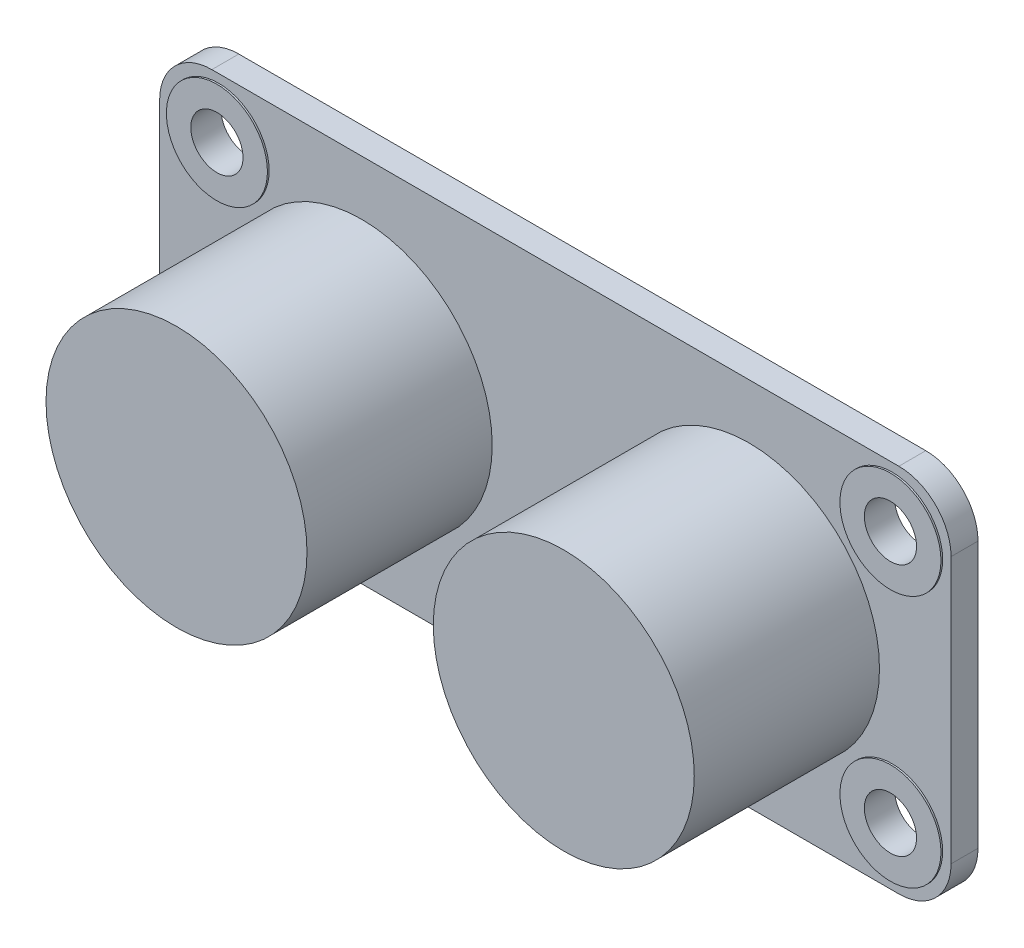
ISO-10303-21;
HEADER;
FILE_DESCRIPTION(('STEP AP214'),'2;1');
FILE_NAME('part.step','',(''),(''),'','','');
FILE_SCHEMA(('AUTOMOTIVE_DESIGN { 1 0 10303 214 1 1 1 1 }'));
ENDSEC;
DATA;
#1=APPLICATION_CONTEXT('core data for automotive mechanical design processes');
#2=APPLICATION_PROTOCOL_DEFINITION('international standard','automotive_design',2000,#1);
#3=PRODUCT_CONTEXT('',#1,'mechanical');
#4=PRODUCT('Part','Part','',(#3));
#5=PRODUCT_RELATED_PRODUCT_CATEGORY('part','',(#4));
#6=PRODUCT_DEFINITION_FORMATION('','',#4);
#7=PRODUCT_DEFINITION_CONTEXT('part definition',#1,'design');
#8=PRODUCT_DEFINITION('design','',#6,#7);
#9=PRODUCT_DEFINITION_SHAPE('','',#8);
#10=(LENGTH_UNIT() NAMED_UNIT(*) SI_UNIT(.MILLI.,.METRE.));
#11=(NAMED_UNIT(*) PLANE_ANGLE_UNIT() SI_UNIT($,.RADIAN.));
#12=(NAMED_UNIT(*) SI_UNIT($,.STERADIAN.) SOLID_ANGLE_UNIT());
#13=UNCERTAINTY_MEASURE_WITH_UNIT(LENGTH_MEASURE(1.E-05),#10,'distance_accuracy_value','');
#14=(GEOMETRIC_REPRESENTATION_CONTEXT(3) GLOBAL_UNCERTAINTY_ASSIGNED_CONTEXT((#13)) GLOBAL_UNIT_ASSIGNED_CONTEXT((#10,
#11,#12)) REPRESENTATION_CONTEXT('',''));
#15=CARTESIAN_POINT('',(0.,0.,0.));
#16=DIRECTION('',(0.,0.,1.));
#17=DIRECTION('',(1.,0.,0.));
#18=AXIS2_PLACEMENT_3D('',#15,#16,#17);
#19=CARTESIAN_POINT('',(0.,0.,1.6));
#20=DIRECTION('',(0.,0.,-1.));
#21=DIRECTION('',(-1.,0.,0.));
#22=AXIS2_PLACEMENT_3D('',#19,#20,#21);
#23=PLANE('',#22);
#24=CARTESIAN_POINT('',(-11.5,0.,1.6));
#25=DIRECTION('',(0.,0.,-1.));
#26=DIRECTION('',(-1.,0.,0.));
#27=AXIS2_PLACEMENT_3D('',#24,#25,#26);
#28=CIRCLE('',#27,7.75);
#29=CARTESIAN_POINT('',(-19.25,0.,1.6));
#30=VERTEX_POINT('',#29);
#31=EDGE_CURVE('E11',#30,#30,#28,.F.);
#32=ORIENTED_EDGE('',*,*,#31,.F.);
#33=EDGE_LOOP('',(#32));
#34=FACE_BOUND('',#33,.T.);
#35=CARTESIAN_POINT('',(11.5,0.,1.6));
#36=DIRECTION('',(0.,0.,-1.));
#37=DIRECTION('',(-1.,0.,0.));
#38=AXIS2_PLACEMENT_3D('',#35,#36,#37);
#39=CIRCLE('',#38,7.75);
#40=CARTESIAN_POINT('',(3.75,0.,1.6));
#41=VERTEX_POINT('',#40);
#42=EDGE_CURVE('E55',#41,#41,#39,.F.);
#43=ORIENTED_EDGE('',*,*,#42,.F.);
#44=EDGE_LOOP('',(#43));
#45=FACE_BOUND('',#44,.T.);
#46=CARTESIAN_POINT('',(20.,-7.5,1.6));
#47=DIRECTION('',(0.,0.,-1.));
#48=DIRECTION('',(-1.,0.,0.));
#49=AXIS2_PLACEMENT_3D('',#46,#47,#48);
#50=CIRCLE('',#49,3.);
#51=CARTESIAN_POINT('',(17.,-7.5,1.6));
#52=VERTEX_POINT('',#51);
#53=EDGE_CURVE('E220',#52,#52,#50,.T.);
#54=ORIENTED_EDGE('',*,*,#53,.T.);
#55=EDGE_LOOP('',(#54));
#56=FACE_BOUND('',#55,.T.);
#57=CARTESIAN_POINT('',(20.,7.5,1.6));
#58=DIRECTION('',(0.,0.,-1.));
#59=DIRECTION('',(-1.,0.,0.));
#60=AXIS2_PLACEMENT_3D('',#57,#58,#59);
#61=CIRCLE('',#60,3.);
#62=CARTESIAN_POINT('',(17.,7.5,1.6));
#63=VERTEX_POINT('',#62);
#64=EDGE_CURVE('E224',#63,#63,#61,.T.);
#65=ORIENTED_EDGE('',*,*,#64,.T.);
#66=EDGE_LOOP('',(#65));
#67=FACE_BOUND('',#66,.T.);
#68=CARTESIAN_POINT('',(-20.,-7.5,1.6));
#69=DIRECTION('',(0.,0.,-1.));
#70=DIRECTION('',(-1.,0.,0.));
#71=AXIS2_PLACEMENT_3D('',#68,#69,#70);
#72=CIRCLE('',#71,3.);
#73=CARTESIAN_POINT('',(-23.,-7.5,1.6));
#74=VERTEX_POINT('',#73);
#75=EDGE_CURVE('E228',#74,#74,#72,.T.);
#76=ORIENTED_EDGE('',*,*,#75,.T.);
#77=EDGE_LOOP('',(#76));
#78=FACE_BOUND('',#77,.T.);
#79=CARTESIAN_POINT('',(-20.,7.5,1.6));
#80=DIRECTION('',(0.,0.,-1.));
#81=DIRECTION('',(-1.,0.,0.));
#82=AXIS2_PLACEMENT_3D('',#79,#80,#81);
#83=CIRCLE('',#82,3.);
#84=CARTESIAN_POINT('',(-23.,7.5,1.6));
#85=VERTEX_POINT('',#84);
#86=EDGE_CURVE('E231',#85,#85,#83,.T.);
#87=ORIENTED_EDGE('',*,*,#86,.T.);
#88=EDGE_LOOP('',(#87));
#89=FACE_BOUND('',#88,.T.);
#90=DIRECTION('',(-1.,0.,0.));
#91=VECTOR('',#90,1.);
#92=CARTESIAN_POINT('',(-23.5,11.,1.6));
#93=LINE('',#92,#91);
#94=CARTESIAN_POINT('',(20.4,11.,1.6));
#95=VERTEX_POINT('',#94);
#96=CARTESIAN_POINT('',(-20.4,11.,1.6));
#97=VERTEX_POINT('',#96);
#98=EDGE_CURVE('E234',#95,#97,#93,.T.);
#99=ORIENTED_EDGE('',*,*,#98,.T.);
#100=CARTESIAN_POINT('',(-20.4,7.9,1.6));
#101=DIRECTION('',(0.,0.,-1.));
#102=DIRECTION('',(-1.,0.,0.));
#103=AXIS2_PLACEMENT_3D('',#100,#101,#102);
#104=CIRCLE('',#103,3.1);
#105=CARTESIAN_POINT('',(-23.5,7.9,1.6));
#106=VERTEX_POINT('',#105);
#107=EDGE_CURVE('E176',#97,#106,#104,.F.);
#108=ORIENTED_EDGE('',*,*,#107,.T.);
#109=DIRECTION('',(0.,-1.,0.));
#110=VECTOR('',#109,1.);
#111=CARTESIAN_POINT('',(-23.5,-11.,1.6));
#112=LINE('',#111,#110);
#113=CARTESIAN_POINT('',(-23.5,-7.9,1.6));
#114=VERTEX_POINT('',#113);
#115=EDGE_CURVE('E134',#106,#114,#112,.T.);
#116=ORIENTED_EDGE('',*,*,#115,.T.);
#117=CARTESIAN_POINT('',(-20.4,-7.9,1.6));
#118=DIRECTION('',(0.,0.,-1.));
#119=DIRECTION('',(-1.,0.,0.));
#120=AXIS2_PLACEMENT_3D('',#117,#118,#119);
#121=CIRCLE('',#120,3.1);
#122=CARTESIAN_POINT('',(-20.4,-11.,1.6));
#123=VERTEX_POINT('',#122);
#124=EDGE_CURVE('E69',#114,#123,#121,.F.);
#125=ORIENTED_EDGE('',*,*,#124,.T.);
#126=DIRECTION('',(1.,0.,0.));
#127=VECTOR('',#126,1.);
#128=CARTESIAN_POINT('',(-23.5,-11.,1.6));
#129=LINE('',#128,#127);
#130=CARTESIAN_POINT('',(20.4,-11.,1.6));
#131=VERTEX_POINT('',#130);
#132=EDGE_CURVE('E154',#123,#131,#129,.T.);
#133=ORIENTED_EDGE('',*,*,#132,.T.);
#134=CARTESIAN_POINT('',(20.4,-7.9,1.6));
#135=DIRECTION('',(0.,0.,-1.));
#136=DIRECTION('',(-1.,0.,0.));
#137=AXIS2_PLACEMENT_3D('',#134,#135,#136);
#138=CIRCLE('',#137,3.1);
#139=CARTESIAN_POINT('',(23.5,-7.9,1.6));
#140=VERTEX_POINT('',#139);
#141=EDGE_CURVE('E171',#131,#140,#138,.F.);
#142=ORIENTED_EDGE('',*,*,#141,.T.);
#143=DIRECTION('',(0.,1.,0.));
#144=VECTOR('',#143,1.);
#145=CARTESIAN_POINT('',(23.5,-11.,1.6));
#146=LINE('',#145,#144);
#147=CARTESIAN_POINT('',(23.5,7.9,1.6));
#148=VERTEX_POINT('',#147);
#149=EDGE_CURVE('E147',#140,#148,#146,.T.);
#150=ORIENTED_EDGE('',*,*,#149,.T.);
#151=CARTESIAN_POINT('',(20.4,7.9,1.6));
#152=DIRECTION('',(0.,0.,-1.));
#153=DIRECTION('',(-1.,0.,0.));
#154=AXIS2_PLACEMENT_3D('',#151,#152,#153);
#155=CIRCLE('',#154,3.1);
#156=EDGE_CURVE('E168',#148,#95,#155,.F.);
#157=ORIENTED_EDGE('',*,*,#156,.T.);
#158=EDGE_LOOP('',(#99,#108,#116,#125,#133,#142,#150,#157));
#159=FACE_BOUND('',#158,.T.);
#160=ADVANCED_FACE('F46',(#34,#45,#56,#67,#78,#89,#159),#23,.F.);
#161=CARTESIAN_POINT('',(0.,0.,0.));
#162=DIRECTION('',(0.,0.,-1.));
#163=DIRECTION('',(-1.,0.,0.));
#164=AXIS2_PLACEMENT_3D('',#161,#162,#163);
#165=PLANE('',#164);
#166=CARTESIAN_POINT('',(20.,-7.5,0.));
#167=DIRECTION('',(0.,0.,-1.));
#168=DIRECTION('',(-1.,0.,0.));
#169=AXIS2_PLACEMENT_3D('',#166,#167,#168);
#170=CIRCLE('',#169,3.);
#171=CARTESIAN_POINT('',(17.,-7.5,0.));
#172=VERTEX_POINT('',#171);
#173=EDGE_CURVE('E204',#172,#172,#170,.T.);
#174=ORIENTED_EDGE('',*,*,#173,.F.);
#175=EDGE_LOOP('',(#174));
#176=FACE_BOUND('',#175,.T.);
#177=CARTESIAN_POINT('',(20.,7.5,0.));
#178=DIRECTION('',(0.,0.,-1.));
#179=DIRECTION('',(-1.,0.,0.));
#180=AXIS2_PLACEMENT_3D('',#177,#178,#179);
#181=CIRCLE('',#180,3.);
#182=CARTESIAN_POINT('',(17.,7.5,0.));
#183=VERTEX_POINT('',#182);
#184=EDGE_CURVE('E200',#183,#183,#181,.T.);
#185=ORIENTED_EDGE('',*,*,#184,.F.);
#186=EDGE_LOOP('',(#185));
#187=FACE_BOUND('',#186,.T.);
#188=CARTESIAN_POINT('',(-20.,-7.5,0.));
#189=DIRECTION('',(0.,0.,-1.));
#190=DIRECTION('',(-1.,0.,0.));
#191=AXIS2_PLACEMENT_3D('',#188,#189,#190);
#192=CIRCLE('',#191,3.);
#193=CARTESIAN_POINT('',(-23.,-7.5,0.));
#194=VERTEX_POINT('',#193);
#195=EDGE_CURVE('E196',#194,#194,#192,.T.);
#196=ORIENTED_EDGE('',*,*,#195,.F.);
#197=EDGE_LOOP('',(#196));
#198=FACE_BOUND('',#197,.T.);
#199=CARTESIAN_POINT('',(-20.,7.5,0.));
#200=DIRECTION('',(0.,0.,-1.));
#201=DIRECTION('',(-1.,0.,0.));
#202=AXIS2_PLACEMENT_3D('',#199,#200,#201);
#203=CIRCLE('',#202,3.);
#204=CARTESIAN_POINT('',(-23.,7.5,0.));
#205=VERTEX_POINT('',#204);
#206=EDGE_CURVE('E192',#205,#205,#203,.T.);
#207=ORIENTED_EDGE('',*,*,#206,.F.);
#208=EDGE_LOOP('',(#207));
#209=FACE_BOUND('',#208,.T.);
#210=DIRECTION('',(0.,-1.,0.));
#211=VECTOR('',#210,1.);
#212=CARTESIAN_POINT('',(-23.5,-11.,0.));
#213=LINE('',#212,#211);
#214=CARTESIAN_POINT('',(-23.5,7.9,0.));
#215=VERTEX_POINT('',#214);
#216=CARTESIAN_POINT('',(-23.5,-7.9,0.));
#217=VERTEX_POINT('',#216);
#218=EDGE_CURVE('E132',#215,#217,#213,.T.);
#219=ORIENTED_EDGE('',*,*,#218,.F.);
#220=CARTESIAN_POINT('',(-20.4,7.9,0.));
#221=DIRECTION('',(0.,0.,-1.));
#222=DIRECTION('',(-1.,0.,0.));
#223=AXIS2_PLACEMENT_3D('',#220,#221,#222);
#224=CIRCLE('',#223,3.1);
#225=CARTESIAN_POINT('',(-20.4,11.,0.));
#226=VERTEX_POINT('',#225);
#227=EDGE_CURVE('E114',#215,#226,#224,.T.);
#228=ORIENTED_EDGE('',*,*,#227,.T.);
#229=DIRECTION('',(-1.,0.,0.));
#230=VECTOR('',#229,1.);
#231=CARTESIAN_POINT('',(-23.5,11.,0.));
#232=LINE('',#231,#230);
#233=CARTESIAN_POINT('',(20.4,11.,0.));
#234=VERTEX_POINT('',#233);
#235=EDGE_CURVE('E143',#234,#226,#232,.T.);
#236=ORIENTED_EDGE('',*,*,#235,.F.);
#237=CARTESIAN_POINT('',(20.4,7.9,0.));
#238=DIRECTION('',(0.,0.,-1.));
#239=DIRECTION('',(-1.,0.,0.));
#240=AXIS2_PLACEMENT_3D('',#237,#238,#239);
#241=CIRCLE('',#240,3.1);
#242=CARTESIAN_POINT('',(23.5,7.9,0.));
#243=VERTEX_POINT('',#242);
#244=EDGE_CURVE('E136',#234,#243,#241,.T.);
#245=ORIENTED_EDGE('',*,*,#244,.T.);
#246=DIRECTION('',(0.,1.,0.));
#247=VECTOR('',#246,1.);
#248=CARTESIAN_POINT('',(23.5,-11.,0.));
#249=LINE('',#248,#247);
#250=CARTESIAN_POINT('',(23.5,-7.9,0.));
#251=VERTEX_POINT('',#250);
#252=EDGE_CURVE('E149',#251,#243,#249,.T.);
#253=ORIENTED_EDGE('',*,*,#252,.F.);
#254=CARTESIAN_POINT('',(20.4,-7.9,0.));
#255=DIRECTION('',(0.,0.,-1.));
#256=DIRECTION('',(-1.,0.,0.));
#257=AXIS2_PLACEMENT_3D('',#254,#255,#256);
#258=CIRCLE('',#257,3.1);
#259=CARTESIAN_POINT('',(20.4,-11.,0.));
#260=VERTEX_POINT('',#259);
#261=EDGE_CURVE('E158',#251,#260,#258,.T.);
#262=ORIENTED_EDGE('',*,*,#261,.T.);
#263=DIRECTION('',(1.,0.,0.));
#264=VECTOR('',#263,1.);
#265=CARTESIAN_POINT('',(-23.5,-11.,0.));
#266=LINE('',#265,#264);
#267=CARTESIAN_POINT('',(-20.4,-11.,0.));
#268=VERTEX_POINT('',#267);
#269=EDGE_CURVE('E142',#268,#260,#266,.T.);
#270=ORIENTED_EDGE('',*,*,#269,.F.);
#271=CARTESIAN_POINT('',(-20.4,-7.9,0.));
#272=DIRECTION('',(0.,0.,-1.));
#273=DIRECTION('',(-1.,0.,0.));
#274=AXIS2_PLACEMENT_3D('',#271,#272,#273);
#275=CIRCLE('',#274,3.1);
#276=EDGE_CURVE('E126',#268,#217,#275,.T.);
#277=ORIENTED_EDGE('',*,*,#276,.T.);
#278=EDGE_LOOP('',(#219,#228,#236,#245,#253,#262,#270,#277));
#279=FACE_BOUND('',#278,.T.);
#280=ADVANCED_FACE('F139',(#176,#187,#198,#209,#279),#165,.T.);
#281=CARTESIAN_POINT('',(23.5,-11.,1.6));
#282=DIRECTION('',(-1.,0.,0.));
#283=DIRECTION('',(0.,0.,1.));
#284=AXIS2_PLACEMENT_3D('',#281,#282,#283);
#285=PLANE('',#284);
#286=ORIENTED_EDGE('',*,*,#149,.F.);
#287=DIRECTION('',(0.,0.,-1.));
#288=VECTOR('',#287,1.);
#289=CARTESIAN_POINT('',(23.5,-7.9,1.6));
#290=LINE('',#289,#288);
#291=EDGE_CURVE('E188',#140,#251,#290,.T.);
#292=ORIENTED_EDGE('',*,*,#291,.T.);
#293=ORIENTED_EDGE('',*,*,#252,.T.);
#294=DIRECTION('',(0.,0.,-1.));
#295=VECTOR('',#294,1.);
#296=CARTESIAN_POINT('',(23.5,7.9,1.6));
#297=LINE('',#296,#295);
#298=EDGE_CURVE('E185',#243,#148,#297,.F.);
#299=ORIENTED_EDGE('',*,*,#298,.T.);
#300=EDGE_LOOP('',(#286,#292,#293,#299));
#301=FACE_BOUND('',#300,.T.);
#302=ADVANCED_FACE('F423',(#301),#285,.F.);
#303=CARTESIAN_POINT('',(-23.5,11.,1.6));
#304=DIRECTION('',(0.,-1.,0.));
#305=DIRECTION('',(0.,0.,-1.));
#306=AXIS2_PLACEMENT_3D('',#303,#304,#305);
#307=PLANE('',#306);
#308=ORIENTED_EDGE('',*,*,#235,.T.);
#309=DIRECTION('',(0.,0.,-1.));
#310=VECTOR('',#309,1.);
#311=CARTESIAN_POINT('',(-20.4,11.,1.6));
#312=LINE('',#311,#310);
#313=EDGE_CURVE('E119',#226,#97,#312,.F.);
#314=ORIENTED_EDGE('',*,*,#313,.T.);
#315=ORIENTED_EDGE('',*,*,#98,.F.);
#316=DIRECTION('',(0.,0.,-1.));
#317=VECTOR('',#316,1.);
#318=CARTESIAN_POINT('',(20.4,11.,1.6));
#319=LINE('',#318,#317);
#320=EDGE_CURVE('E125',#95,#234,#319,.T.);
#321=ORIENTED_EDGE('',*,*,#320,.T.);
#322=EDGE_LOOP('',(#308,#314,#315,#321));
#323=FACE_BOUND('',#322,.T.);
#324=ADVANCED_FACE('F430',(#323),#307,.F.);
#325=CARTESIAN_POINT('',(-23.5,-11.,1.6));
#326=DIRECTION('',(1.,0.,0.));
#327=DIRECTION('',(0.,0.,-1.));
#328=AXIS2_PLACEMENT_3D('',#325,#326,#327);
#329=PLANE('',#328);
#330=ORIENTED_EDGE('',*,*,#115,.F.);
#331=DIRECTION('',(0.,0.,-1.));
#332=VECTOR('',#331,1.);
#333=CARTESIAN_POINT('',(-23.5,7.9,1.6));
#334=LINE('',#333,#332);
#335=EDGE_CURVE('E118',#106,#215,#334,.T.);
#336=ORIENTED_EDGE('',*,*,#335,.T.);
#337=ORIENTED_EDGE('',*,*,#218,.T.);
#338=DIRECTION('',(0.,0.,-1.));
#339=VECTOR('',#338,1.);
#340=CARTESIAN_POINT('',(-23.5,-7.9,1.6));
#341=LINE('',#340,#339);
#342=EDGE_CURVE('E137',#217,#114,#341,.F.);
#343=ORIENTED_EDGE('',*,*,#342,.T.);
#344=EDGE_LOOP('',(#330,#336,#337,#343));
#345=FACE_BOUND('',#344,.T.);
#346=ADVANCED_FACE('F131',(#345),#329,.F.);
#347=CARTESIAN_POINT('',(-23.5,-11.,1.6));
#348=DIRECTION('',(0.,1.,0.));
#349=DIRECTION('',(0.,0.,1.));
#350=AXIS2_PLACEMENT_3D('',#347,#348,#349);
#351=PLANE('',#350);
#352=ORIENTED_EDGE('',*,*,#132,.F.);
#353=DIRECTION('',(0.,0.,-1.));
#354=VECTOR('',#353,1.);
#355=CARTESIAN_POINT('',(-20.4,-11.,1.6));
#356=LINE('',#355,#354);
#357=EDGE_CURVE('E181',#123,#268,#356,.T.);
#358=ORIENTED_EDGE('',*,*,#357,.T.);
#359=ORIENTED_EDGE('',*,*,#269,.T.);
#360=DIRECTION('',(0.,0.,-1.));
#361=VECTOR('',#360,1.);
#362=CARTESIAN_POINT('',(20.4,-11.,1.6));
#363=LINE('',#362,#361);
#364=EDGE_CURVE('E62',#260,#131,#363,.F.);
#365=ORIENTED_EDGE('',*,*,#364,.T.);
#366=EDGE_LOOP('',(#352,#358,#359,#365));
#367=FACE_BOUND('',#366,.T.);
#368=ADVANCED_FACE('F425',(#367),#351,.F.);
#369=CARTESIAN_POINT('',(-20.4,7.9,1.6));
#370=DIRECTION('',(0.,0.,-1.));
#371=DIRECTION('',(-1.,0.,0.));
#372=AXIS2_PLACEMENT_3D('',#369,#370,#371);
#373=CYLINDRICAL_SURFACE('',#372,3.1);
#374=ORIENTED_EDGE('',*,*,#107,.F.);
#375=ORIENTED_EDGE('',*,*,#313,.F.);
#376=ORIENTED_EDGE('',*,*,#227,.F.);
#377=ORIENTED_EDGE('',*,*,#335,.F.);
#378=EDGE_LOOP('',(#374,#375,#376,#377));
#379=FACE_BOUND('',#378,.T.);
#380=ADVANCED_FACE('F117',(#379),#373,.T.);
#381=CARTESIAN_POINT('',(-20.4,-7.9,1.6));
#382=DIRECTION('',(0.,0.,-1.));
#383=DIRECTION('',(-1.,0.,0.));
#384=AXIS2_PLACEMENT_3D('',#381,#382,#383);
#385=CYLINDRICAL_SURFACE('',#384,3.1);
#386=ORIENTED_EDGE('',*,*,#124,.F.);
#387=ORIENTED_EDGE('',*,*,#342,.F.);
#388=ORIENTED_EDGE('',*,*,#276,.F.);
#389=ORIENTED_EDGE('',*,*,#357,.F.);
#390=EDGE_LOOP('',(#386,#387,#388,#389));
#391=FACE_BOUND('',#390,.T.);
#392=ADVANCED_FACE('F437',(#391),#385,.T.);
#393=CARTESIAN_POINT('',(20.4,-7.9,1.6));
#394=DIRECTION('',(0.,0.,-1.));
#395=DIRECTION('',(-1.,0.,0.));
#396=AXIS2_PLACEMENT_3D('',#393,#394,#395);
#397=CYLINDRICAL_SURFACE('',#396,3.1);
#398=ORIENTED_EDGE('',*,*,#141,.F.);
#399=ORIENTED_EDGE('',*,*,#364,.F.);
#400=ORIENTED_EDGE('',*,*,#261,.F.);
#401=ORIENTED_EDGE('',*,*,#291,.F.);
#402=EDGE_LOOP('',(#398,#399,#400,#401));
#403=FACE_BOUND('',#402,.T.);
#404=ADVANCED_FACE('F439',(#403),#397,.T.);
#405=CARTESIAN_POINT('',(20.4,7.9,1.6));
#406=DIRECTION('',(0.,0.,-1.));
#407=DIRECTION('',(-1.,0.,0.));
#408=AXIS2_PLACEMENT_3D('',#405,#406,#407);
#409=CYLINDRICAL_SURFACE('',#408,3.1);
#410=ORIENTED_EDGE('',*,*,#156,.F.);
#411=ORIENTED_EDGE('',*,*,#298,.F.);
#412=ORIENTED_EDGE('',*,*,#244,.F.);
#413=ORIENTED_EDGE('',*,*,#320,.F.);
#414=EDGE_LOOP('',(#410,#411,#412,#413));
#415=FACE_BOUND('',#414,.T.);
#416=ADVANCED_FACE('F48',(#415),#409,.T.);
#417=CARTESIAN_POINT('',(-20.,7.5,-0.0999999999999998));
#418=DIRECTION('',(0.,0.,1.));
#419=DIRECTION('',(1.,0.,0.));
#420=AXIS2_PLACEMENT_3D('',#417,#418,#419);
#421=CYLINDRICAL_SURFACE('',#420,3.);
#422=ORIENTED_EDGE('',*,*,#206,.T.);
#423=EDGE_LOOP('',(#422));
#424=FACE_BOUND('',#423,.T.);
#425=CARTESIAN_POINT('',(-20.,7.5,-0.0999999999999998));
#426=DIRECTION('',(0.,0.,1.));
#427=DIRECTION('',(1.,0.,0.));
#428=AXIS2_PLACEMENT_3D('',#425,#426,#427);
#429=CIRCLE('',#428,3.);
#430=CARTESIAN_POINT('',(-17.,7.5,-0.0999999999999998));
#431=VERTEX_POINT('',#430);
#432=EDGE_CURVE('E254',#431,#431,#429,.T.);
#433=ORIENTED_EDGE('',*,*,#432,.T.);
#434=EDGE_LOOP('',(#433));
#435=FACE_BOUND('',#434,.T.);
#436=ADVANCED_FACE('F404',(#424,#435),#421,.T.);
#437=CARTESIAN_POINT('',(-20.,7.5,-0.0999999999999998));
#438=DIRECTION('',(0.,0.,1.));
#439=DIRECTION('',(1.,0.,0.));
#440=AXIS2_PLACEMENT_3D('',#437,#438,#439);
#441=PLANE('',#440);
#442=CARTESIAN_POINT('',(-20.,7.5,-0.0999999999999998));
#443=DIRECTION('',(0.,0.,1.));
#444=DIRECTION('',(1.,0.,0.));
#445=AXIS2_PLACEMENT_3D('',#442,#443,#444);
#446=CIRCLE('',#445,1.55);
#447=CARTESIAN_POINT('',(-18.45,7.5,-0.0999999999999998));
#448=VERTEX_POINT('',#447);
#449=EDGE_CURVE('E257',#448,#448,#446,.T.);
#450=ORIENTED_EDGE('',*,*,#449,.T.);
#451=EDGE_LOOP('',(#450));
#452=FACE_BOUND('',#451,.T.);
#453=ORIENTED_EDGE('',*,*,#432,.F.);
#454=EDGE_LOOP('',(#453));
#455=FACE_BOUND('',#454,.T.);
#456=ADVANCED_FACE('F400',(#452,#455),#441,.F.);
#457=CARTESIAN_POINT('',(-20.,7.5,1.6));
#458=DIRECTION('',(0.,0.,-1.));
#459=DIRECTION('',(-1.,0.,0.));
#460=AXIS2_PLACEMENT_3D('',#457,#458,#459);
#461=CYLINDRICAL_SURFACE('',#460,1.55);
#462=ORIENTED_EDGE('',*,*,#449,.F.);
#463=EDGE_LOOP('',(#462));
#464=FACE_BOUND('',#463,.T.);
#465=CARTESIAN_POINT('',(-20.,7.5,1.7));
#466=DIRECTION('',(0.,0.,1.));
#467=DIRECTION('',(1.,0.,0.));
#468=AXIS2_PLACEMENT_3D('',#465,#466,#467);
#469=CIRCLE('',#468,1.55);
#470=CARTESIAN_POINT('',(-18.45,7.5,1.7));
#471=VERTEX_POINT('',#470);
#472=EDGE_CURVE('E267',#471,#471,#469,.T.);
#473=ORIENTED_EDGE('',*,*,#472,.T.);
#474=EDGE_LOOP('',(#473));
#475=FACE_BOUND('',#474,.T.);
#476=ADVANCED_FACE('F403',(#464,#475),#461,.F.);
#477=CARTESIAN_POINT('',(-20.,7.5,1.7));
#478=DIRECTION('',(0.,0.,1.));
#479=DIRECTION('',(1.,0.,0.));
#480=AXIS2_PLACEMENT_3D('',#477,#478,#479);
#481=CIRCLE('',#480,3.);
#482=CARTESIAN_POINT('',(-17.,7.5,1.7));
#483=VERTEX_POINT('',#482);
#484=EDGE_CURVE('E263',#483,#483,#481,.T.);
#485=ORIENTED_EDGE('',*,*,#484,.F.);
#486=EDGE_LOOP('',(#485));
#487=FACE_BOUND('',#486,.T.);
#488=ORIENTED_EDGE('',*,*,#86,.F.);
#489=EDGE_LOOP('',(#488));
#490=FACE_BOUND('',#489,.T.);
#491=ADVANCED_FACE('F398',(#487,#490),#421,.T.);
#492=CARTESIAN_POINT('',(-20.,7.5,1.7));
#493=DIRECTION('',(0.,0.,1.));
#494=DIRECTION('',(1.,0.,0.));
#495=AXIS2_PLACEMENT_3D('',#492,#493,#494);
#496=PLANE('',#495);
#497=ORIENTED_EDGE('',*,*,#484,.T.);
#498=EDGE_LOOP('',(#497));
#499=FACE_BOUND('',#498,.T.);
#500=ORIENTED_EDGE('',*,*,#472,.F.);
#501=EDGE_LOOP('',(#500));
#502=FACE_BOUND('',#501,.T.);
#503=ADVANCED_FACE('F394',(#499,#502),#496,.T.);
#504=CARTESIAN_POINT('',(-20.,-7.5,-0.0999999999999998));
#505=DIRECTION('',(0.,0.,1.));
#506=DIRECTION('',(1.,0.,0.));
#507=AXIS2_PLACEMENT_3D('',#504,#505,#506);
#508=CYLINDRICAL_SURFACE('',#507,3.);
#509=ORIENTED_EDGE('',*,*,#195,.T.);
#510=EDGE_LOOP('',(#509));
#511=FACE_BOUND('',#510,.T.);
#512=CARTESIAN_POINT('',(-20.,-7.5,-0.0999999999999998));
#513=DIRECTION('',(0.,0.,1.));
#514=DIRECTION('',(1.,0.,0.));
#515=AXIS2_PLACEMENT_3D('',#512,#513,#514);
#516=CIRCLE('',#515,3.);
#517=CARTESIAN_POINT('',(-17.,-7.5,-0.0999999999999998));
#518=VERTEX_POINT('',#517);
#519=EDGE_CURVE('E273',#518,#518,#516,.T.);
#520=ORIENTED_EDGE('',*,*,#519,.T.);
#521=EDGE_LOOP('',(#520));
#522=FACE_BOUND('',#521,.T.);
#523=ADVANCED_FACE('F390',(#511,#522),#508,.T.);
#524=CARTESIAN_POINT('',(-20.,-7.5,-0.0999999999999998));
#525=DIRECTION('',(0.,0.,1.));
#526=DIRECTION('',(1.,0.,0.));
#527=AXIS2_PLACEMENT_3D('',#524,#525,#526);
#528=PLANE('',#527);
#529=CARTESIAN_POINT('',(-20.,-7.5,-0.0999999999999998));
#530=DIRECTION('',(0.,0.,1.));
#531=DIRECTION('',(1.,0.,0.));
#532=AXIS2_PLACEMENT_3D('',#529,#530,#531);
#533=CIRCLE('',#532,1.55);
#534=CARTESIAN_POINT('',(-18.45,-7.5,-0.0999999999999998));
#535=VERTEX_POINT('',#534);
#536=EDGE_CURVE('E277',#535,#535,#533,.T.);
#537=ORIENTED_EDGE('',*,*,#536,.T.);
#538=EDGE_LOOP('',(#537));
#539=FACE_BOUND('',#538,.T.);
#540=ORIENTED_EDGE('',*,*,#519,.F.);
#541=EDGE_LOOP('',(#540));
#542=FACE_BOUND('',#541,.T.);
#543=ADVANCED_FACE('F386',(#539,#542),#528,.F.);
#544=CARTESIAN_POINT('',(-20.,-7.5,1.6));
#545=DIRECTION('',(0.,0.,-1.));
#546=DIRECTION('',(-1.,0.,0.));
#547=AXIS2_PLACEMENT_3D('',#544,#545,#546);
#548=CYLINDRICAL_SURFACE('',#547,1.55);
#549=ORIENTED_EDGE('',*,*,#536,.F.);
#550=EDGE_LOOP('',(#549));
#551=FACE_BOUND('',#550,.T.);
#552=CARTESIAN_POINT('',(-20.,-7.5,1.7));
#553=DIRECTION('',(0.,0.,1.));
#554=DIRECTION('',(1.,0.,0.));
#555=AXIS2_PLACEMENT_3D('',#552,#553,#554);
#556=CIRCLE('',#555,1.55);
#557=CARTESIAN_POINT('',(-18.45,-7.5,1.7));
#558=VERTEX_POINT('',#557);
#559=EDGE_CURVE('E285',#558,#558,#556,.T.);
#560=ORIENTED_EDGE('',*,*,#559,.T.);
#561=EDGE_LOOP('',(#560));
#562=FACE_BOUND('',#561,.T.);
#563=ADVANCED_FACE('F389',(#551,#562),#548,.F.);
#564=CARTESIAN_POINT('',(-20.,-7.5,1.7));
#565=DIRECTION('',(0.,0.,1.));
#566=DIRECTION('',(1.,0.,0.));
#567=AXIS2_PLACEMENT_3D('',#564,#565,#566);
#568=CIRCLE('',#567,3.);
#569=CARTESIAN_POINT('',(-17.,-7.5,1.7));
#570=VERTEX_POINT('',#569);
#571=EDGE_CURVE('E281',#570,#570,#568,.T.);
#572=ORIENTED_EDGE('',*,*,#571,.F.);
#573=EDGE_LOOP('',(#572));
#574=FACE_BOUND('',#573,.T.);
#575=ORIENTED_EDGE('',*,*,#75,.F.);
#576=EDGE_LOOP('',(#575));
#577=FACE_BOUND('',#576,.T.);
#578=ADVANCED_FACE('F384',(#574,#577),#508,.T.);
#579=CARTESIAN_POINT('',(-20.,-7.5,1.7));
#580=DIRECTION('',(0.,0.,1.));
#581=DIRECTION('',(1.,0.,0.));
#582=AXIS2_PLACEMENT_3D('',#579,#580,#581);
#583=PLANE('',#582);
#584=ORIENTED_EDGE('',*,*,#571,.T.);
#585=EDGE_LOOP('',(#584));
#586=FACE_BOUND('',#585,.T.);
#587=ORIENTED_EDGE('',*,*,#559,.F.);
#588=EDGE_LOOP('',(#587));
#589=FACE_BOUND('',#588,.T.);
#590=ADVANCED_FACE('F380',(#586,#589),#583,.T.);
#591=CARTESIAN_POINT('',(20.,7.5,-0.0999999999999998));
#592=DIRECTION('',(0.,0.,1.));
#593=DIRECTION('',(1.,0.,0.));
#594=AXIS2_PLACEMENT_3D('',#591,#592,#593);
#595=CYLINDRICAL_SURFACE('',#594,3.);
#596=ORIENTED_EDGE('',*,*,#184,.T.);
#597=EDGE_LOOP('',(#596));
#598=FACE_BOUND('',#597,.T.);
#599=CARTESIAN_POINT('',(20.,7.5,-0.0999999999999998));
#600=DIRECTION('',(0.,0.,1.));
#601=DIRECTION('',(1.,0.,0.));
#602=AXIS2_PLACEMENT_3D('',#599,#600,#601);
#603=CIRCLE('',#602,3.);
#604=CARTESIAN_POINT('',(23.,7.5,-0.0999999999999998));
#605=VERTEX_POINT('',#604);
#606=EDGE_CURVE('E291',#605,#605,#603,.T.);
#607=ORIENTED_EDGE('',*,*,#606,.T.);
#608=EDGE_LOOP('',(#607));
#609=FACE_BOUND('',#608,.T.);
#610=ADVANCED_FACE('F376',(#598,#609),#595,.T.);
#611=CARTESIAN_POINT('',(20.,7.5,-0.0999999999999998));
#612=DIRECTION('',(0.,0.,1.));
#613=DIRECTION('',(1.,0.,0.));
#614=AXIS2_PLACEMENT_3D('',#611,#612,#613);
#615=PLANE('',#614);
#616=CARTESIAN_POINT('',(20.,7.5,-0.0999999999999998));
#617=DIRECTION('',(0.,0.,1.));
#618=DIRECTION('',(1.,0.,0.));
#619=AXIS2_PLACEMENT_3D('',#616,#617,#618);
#620=CIRCLE('',#619,1.55);
#621=CARTESIAN_POINT('',(21.55,7.5,-0.0999999999999998));
#622=VERTEX_POINT('',#621);
#623=EDGE_CURVE('E295',#622,#622,#620,.T.);
#624=ORIENTED_EDGE('',*,*,#623,.T.);
#625=EDGE_LOOP('',(#624));
#626=FACE_BOUND('',#625,.T.);
#627=ORIENTED_EDGE('',*,*,#606,.F.);
#628=EDGE_LOOP('',(#627));
#629=FACE_BOUND('',#628,.T.);
#630=ADVANCED_FACE('F372',(#626,#629),#615,.F.);
#631=CARTESIAN_POINT('',(20.,7.5,1.6));
#632=DIRECTION('',(0.,0.,-1.));
#633=DIRECTION('',(-1.,0.,0.));
#634=AXIS2_PLACEMENT_3D('',#631,#632,#633);
#635=CYLINDRICAL_SURFACE('',#634,1.55);
#636=ORIENTED_EDGE('',*,*,#623,.F.);
#637=EDGE_LOOP('',(#636));
#638=FACE_BOUND('',#637,.T.);
#639=CARTESIAN_POINT('',(20.,7.5,1.7));
#640=DIRECTION('',(0.,0.,1.));
#641=DIRECTION('',(1.,0.,0.));
#642=AXIS2_PLACEMENT_3D('',#639,#640,#641);
#643=CIRCLE('',#642,1.55);
#644=CARTESIAN_POINT('',(21.55,7.5,1.7));
#645=VERTEX_POINT('',#644);
#646=EDGE_CURVE('E303',#645,#645,#643,.T.);
#647=ORIENTED_EDGE('',*,*,#646,.T.);
#648=EDGE_LOOP('',(#647));
#649=FACE_BOUND('',#648,.T.);
#650=ADVANCED_FACE('F375',(#638,#649),#635,.F.);
#651=CARTESIAN_POINT('',(20.,7.5,1.7));
#652=DIRECTION('',(0.,0.,1.));
#653=DIRECTION('',(1.,0.,0.));
#654=AXIS2_PLACEMENT_3D('',#651,#652,#653);
#655=CIRCLE('',#654,3.);
#656=CARTESIAN_POINT('',(23.,7.5,1.7));
#657=VERTEX_POINT('',#656);
#658=EDGE_CURVE('E299',#657,#657,#655,.T.);
#659=ORIENTED_EDGE('',*,*,#658,.F.);
#660=EDGE_LOOP('',(#659));
#661=FACE_BOUND('',#660,.T.);
#662=ORIENTED_EDGE('',*,*,#64,.F.);
#663=EDGE_LOOP('',(#662));
#664=FACE_BOUND('',#663,.T.);
#665=ADVANCED_FACE('F370',(#661,#664),#595,.T.);
#666=CARTESIAN_POINT('',(20.,7.5,1.7));
#667=DIRECTION('',(0.,0.,1.));
#668=DIRECTION('',(1.,0.,0.));
#669=AXIS2_PLACEMENT_3D('',#666,#667,#668);
#670=PLANE('',#669);
#671=ORIENTED_EDGE('',*,*,#658,.T.);
#672=EDGE_LOOP('',(#671));
#673=FACE_BOUND('',#672,.T.);
#674=ORIENTED_EDGE('',*,*,#646,.F.);
#675=EDGE_LOOP('',(#674));
#676=FACE_BOUND('',#675,.T.);
#677=ADVANCED_FACE('F366',(#673,#676),#670,.T.);
#678=CARTESIAN_POINT('',(20.,-7.5,-0.0999999999999998));
#679=DIRECTION('',(0.,0.,1.));
#680=DIRECTION('',(1.,0.,0.));
#681=AXIS2_PLACEMENT_3D('',#678,#679,#680);
#682=CYLINDRICAL_SURFACE('',#681,3.);
#683=ORIENTED_EDGE('',*,*,#173,.T.);
#684=EDGE_LOOP('',(#683));
#685=FACE_BOUND('',#684,.T.);
#686=CARTESIAN_POINT('',(20.,-7.5,-0.0999999999999998));
#687=DIRECTION('',(0.,0.,1.));
#688=DIRECTION('',(1.,0.,0.));
#689=AXIS2_PLACEMENT_3D('',#686,#687,#688);
#690=CIRCLE('',#689,3.);
#691=CARTESIAN_POINT('',(23.,-7.5,-0.0999999999999998));
#692=VERTEX_POINT('',#691);
#693=EDGE_CURVE('E309',#692,#692,#690,.T.);
#694=ORIENTED_EDGE('',*,*,#693,.T.);
#695=EDGE_LOOP('',(#694));
#696=FACE_BOUND('',#695,.T.);
#697=ADVANCED_FACE('F362',(#685,#696),#682,.T.);
#698=CARTESIAN_POINT('',(20.,-7.5,-0.0999999999999998));
#699=DIRECTION('',(0.,0.,1.));
#700=DIRECTION('',(1.,0.,0.));
#701=AXIS2_PLACEMENT_3D('',#698,#699,#700);
#702=PLANE('',#701);
#703=CARTESIAN_POINT('',(20.,-7.5,-0.0999999999999998));
#704=DIRECTION('',(0.,0.,1.));
#705=DIRECTION('',(1.,0.,0.));
#706=AXIS2_PLACEMENT_3D('',#703,#704,#705);
#707=CIRCLE('',#706,1.55);
#708=CARTESIAN_POINT('',(21.55,-7.5,-0.0999999999999998));
#709=VERTEX_POINT('',#708);
#710=EDGE_CURVE('E313',#709,#709,#707,.T.);
#711=ORIENTED_EDGE('',*,*,#710,.T.);
#712=EDGE_LOOP('',(#711));
#713=FACE_BOUND('',#712,.T.);
#714=ORIENTED_EDGE('',*,*,#693,.F.);
#715=EDGE_LOOP('',(#714));
#716=FACE_BOUND('',#715,.T.);
#717=ADVANCED_FACE('F358',(#713,#716),#702,.F.);
#718=CARTESIAN_POINT('',(20.,-7.5,1.6));
#719=DIRECTION('',(0.,0.,-1.));
#720=DIRECTION('',(-1.,0.,0.));
#721=AXIS2_PLACEMENT_3D('',#718,#719,#720);
#722=CYLINDRICAL_SURFACE('',#721,1.55);
#723=ORIENTED_EDGE('',*,*,#710,.F.);
#724=EDGE_LOOP('',(#723));
#725=FACE_BOUND('',#724,.T.);
#726=CARTESIAN_POINT('',(20.,-7.5,1.7));
#727=DIRECTION('',(0.,0.,1.));
#728=DIRECTION('',(1.,0.,0.));
#729=AXIS2_PLACEMENT_3D('',#726,#727,#728);
#730=CIRCLE('',#729,1.55);
#731=CARTESIAN_POINT('',(21.55,-7.5,1.7));
#732=VERTEX_POINT('',#731);
#733=EDGE_CURVE('E321',#732,#732,#730,.T.);
#734=ORIENTED_EDGE('',*,*,#733,.T.);
#735=EDGE_LOOP('',(#734));
#736=FACE_BOUND('',#735,.T.);
#737=ADVANCED_FACE('F361',(#725,#736),#722,.F.);
#738=CARTESIAN_POINT('',(20.,-7.5,1.7));
#739=DIRECTION('',(0.,0.,1.));
#740=DIRECTION('',(1.,0.,0.));
#741=AXIS2_PLACEMENT_3D('',#738,#739,#740);
#742=CIRCLE('',#741,3.);
#743=CARTESIAN_POINT('',(23.,-7.5,1.7));
#744=VERTEX_POINT('',#743);
#745=EDGE_CURVE('E317',#744,#744,#742,.T.);
#746=ORIENTED_EDGE('',*,*,#745,.F.);
#747=EDGE_LOOP('',(#746));
#748=FACE_BOUND('',#747,.T.);
#749=ORIENTED_EDGE('',*,*,#53,.F.);
#750=EDGE_LOOP('',(#749));
#751=FACE_BOUND('',#750,.T.);
#752=ADVANCED_FACE('F356',(#748,#751),#682,.T.);
#753=CARTESIAN_POINT('',(20.,-7.5,1.7));
#754=DIRECTION('',(0.,0.,1.));
#755=DIRECTION('',(1.,0.,0.));
#756=AXIS2_PLACEMENT_3D('',#753,#754,#755);
#757=PLANE('',#756);
#758=ORIENTED_EDGE('',*,*,#745,.T.);
#759=EDGE_LOOP('',(#758));
#760=FACE_BOUND('',#759,.T.);
#761=ORIENTED_EDGE('',*,*,#733,.F.);
#762=EDGE_LOOP('',(#761));
#763=FACE_BOUND('',#762,.T.);
#764=ADVANCED_FACE('F352',(#760,#763),#757,.T.);
#765=CARTESIAN_POINT('',(11.5,0.,12.6));
#766=DIRECTION('',(0.,0.,-1.));
#767=DIRECTION('',(-1.,0.,0.));
#768=AXIS2_PLACEMENT_3D('',#765,#766,#767);
#769=CYLINDRICAL_SURFACE('',#768,7.75);
#770=CARTESIAN_POINT('',(11.5,0.,12.6));
#771=DIRECTION('',(0.,0.,1.));
#772=DIRECTION('',(1.,0.,0.));
#773=AXIS2_PLACEMENT_3D('',#770,#771,#772);
#774=CIRCLE('',#773,7.75);
#775=CARTESIAN_POINT('',(19.25,0.,12.6));
#776=VERTEX_POINT('',#775);
#777=EDGE_CURVE('E325',#776,#776,#774,.T.);
#778=ORIENTED_EDGE('',*,*,#777,.F.);
#779=EDGE_LOOP('',(#778));
#780=FACE_BOUND('',#779,.T.);
#781=ORIENTED_EDGE('',*,*,#42,.T.);
#782=EDGE_LOOP('',(#781));
#783=FACE_BOUND('',#782,.T.);
#784=ADVANCED_FACE('F211',(#780,#783),#769,.T.);
#785=CARTESIAN_POINT('',(11.5,0.,12.6));
#786=DIRECTION('',(0.,0.,1.));
#787=DIRECTION('',(1.,0.,0.));
#788=AXIS2_PLACEMENT_3D('',#785,#786,#787);
#789=PLANE('',#788);
#790=ORIENTED_EDGE('',*,*,#777,.T.);
#791=EDGE_LOOP('',(#790));
#792=FACE_BOUND('',#791,.T.);
#793=ADVANCED_FACE('F339',(#792),#789,.T.);
#794=CARTESIAN_POINT('',(-11.5,0.,12.6));
#795=DIRECTION('',(0.,0.,-1.));
#796=DIRECTION('',(-1.,0.,0.));
#797=AXIS2_PLACEMENT_3D('',#794,#795,#796);
#798=CYLINDRICAL_SURFACE('',#797,7.75);
#799=CARTESIAN_POINT('',(-11.5,0.,12.6));
#800=DIRECTION('',(0.,0.,1.));
#801=DIRECTION('',(1.,0.,0.));
#802=AXIS2_PLACEMENT_3D('',#799,#800,#801);
#803=CIRCLE('',#802,7.75);
#804=CARTESIAN_POINT('',(-3.75,0.,12.6));
#805=VERTEX_POINT('',#804);
#806=EDGE_CURVE('E329',#805,#805,#803,.T.);
#807=ORIENTED_EDGE('',*,*,#806,.F.);
#808=EDGE_LOOP('',(#807));
#809=FACE_BOUND('',#808,.T.);
#810=ORIENTED_EDGE('',*,*,#31,.T.);
#811=EDGE_LOOP('',(#810));
#812=FACE_BOUND('',#811,.T.);
#813=ADVANCED_FACE('F336',(#809,#812),#798,.T.);
#814=CARTESIAN_POINT('',(-11.5,0.,12.6));
#815=DIRECTION('',(0.,0.,1.));
#816=DIRECTION('',(1.,0.,0.));
#817=AXIS2_PLACEMENT_3D('',#814,#815,#816);
#818=PLANE('',#817);
#819=ORIENTED_EDGE('',*,*,#806,.T.);
#820=EDGE_LOOP('',(#819));
#821=FACE_BOUND('',#820,.T.);
#822=ADVANCED_FACE('F334',(#821),#818,.T.);
#823=CLOSED_SHELL('',(#160,#280,#302,#324,#346,#368,#380,#392,#404,#416,#436,#456,#476,#491,
#503,#523,#543,#563,#578,#590,#610,#630,#650,#665,#677,#697,#717,#737,#752,#764,#784,#793,#813,#822));
#824=MANIFOLD_SOLID_BREP('B2',#823);
#825=ADVANCED_BREP_SHAPE_REPRESENTATION('',(#18,#824),#14);
#826=SHAPE_DEFINITION_REPRESENTATION(#9,#825);
ENDSEC;
END-ISO-10303-21;
